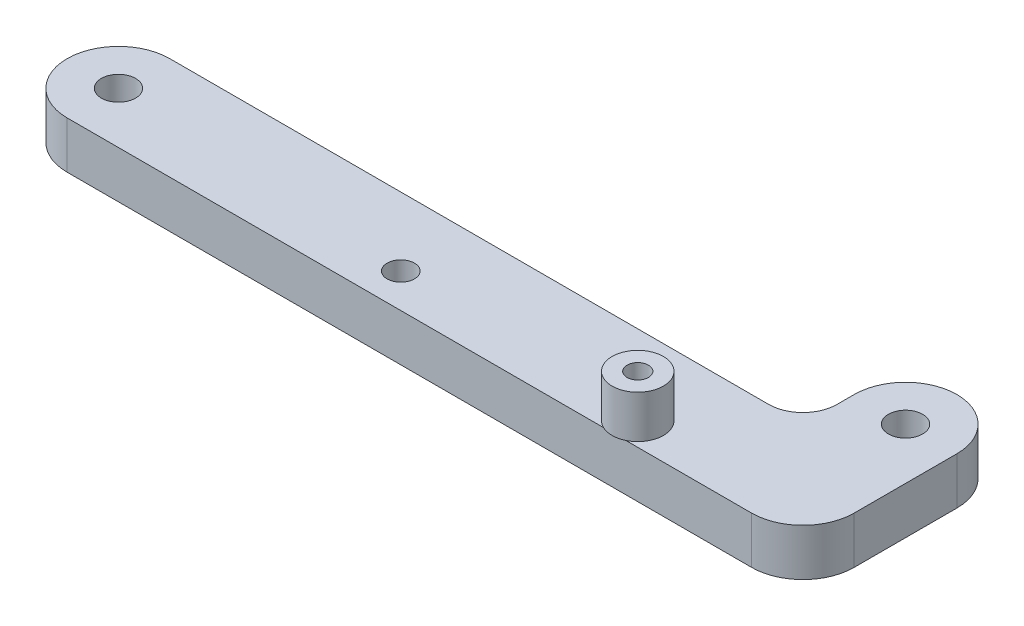
ISO-10303-21;
HEADER;
FILE_DESCRIPTION(('STEP AP214'),'2;1');
FILE_NAME('part.step','',(''),(''),'','','');
FILE_SCHEMA(('AUTOMOTIVE_DESIGN { 1 0 10303 214 1 1 1 1 }'));
ENDSEC;
DATA;
#1=APPLICATION_CONTEXT('core data for automotive mechanical design processes');
#2=APPLICATION_PROTOCOL_DEFINITION('international standard','automotive_design',2000,#1);
#3=PRODUCT_CONTEXT('',#1,'mechanical');
#4=PRODUCT('Part','Part','',(#3));
#5=PRODUCT_RELATED_PRODUCT_CATEGORY('part','',(#4));
#6=PRODUCT_DEFINITION_FORMATION('','',#4);
#7=PRODUCT_DEFINITION_CONTEXT('part definition',#1,'design');
#8=PRODUCT_DEFINITION('design','',#6,#7);
#9=PRODUCT_DEFINITION_SHAPE('','',#8);
#10=(LENGTH_UNIT() NAMED_UNIT(*) SI_UNIT(.MILLI.,.METRE.));
#11=(NAMED_UNIT(*) PLANE_ANGLE_UNIT() SI_UNIT($,.RADIAN.));
#12=(NAMED_UNIT(*) SI_UNIT($,.STERADIAN.) SOLID_ANGLE_UNIT());
#13=UNCERTAINTY_MEASURE_WITH_UNIT(LENGTH_MEASURE(1.E-05),#10,'distance_accuracy_value','');
#14=(GEOMETRIC_REPRESENTATION_CONTEXT(3) GLOBAL_UNCERTAINTY_ASSIGNED_CONTEXT((#13)) GLOBAL_UNIT_ASSIGNED_CONTEXT((#10,
#11,#12)) REPRESENTATION_CONTEXT('',''));
#15=CARTESIAN_POINT('',(0.,0.,0.));
#16=DIRECTION('',(0.,0.,1.));
#17=DIRECTION('',(1.,0.,0.));
#18=AXIS2_PLACEMENT_3D('',#15,#16,#17);
#19=CARTESIAN_POINT('',(0.,5.5,0.));
#20=DIRECTION('',(0.,1.,0.));
#21=DIRECTION('',(0.,0.,-1.));
#22=AXIS2_PLACEMENT_3D('',#19,#20,#21);
#23=PLANE('',#22);
#24=CARTESIAN_POINT('',(35.,5.5,2.));
#25=DIRECTION('',(0.,-1.,0.));
#26=DIRECTION('',(0.,0.,-1.));
#27=AXIS2_PLACEMENT_3D('',#24,#25,#26);
#28=CIRCLE('',#27,1.6);
#29=CARTESIAN_POINT('',(35.,5.5,0.400000000000002));
#30=VERTEX_POINT('',#29);
#31=EDGE_CURVE('E218',#30,#30,#28,.T.);
#32=ORIENTED_EDGE('',*,*,#31,.T.);
#33=EDGE_LOOP('',(#32));
#34=FACE_BOUND('',#33,.T.);
#35=DIRECTION('',(1.,0.,0.));
#36=VECTOR('',#35,1.);
#37=CARTESIAN_POINT('',(0.,5.5,-6.));
#38=LINE('',#37,#36);
#39=CARTESIAN_POINT('',(0.,5.5,-6.));
#40=VERTEX_POINT('',#39);
#41=CARTESIAN_POINT('',(70.,5.5,-6.));
#42=VERTEX_POINT('',#41);
#43=EDGE_CURVE('E159',#40,#42,#38,.T.);
#44=ORIENTED_EDGE('',*,*,#43,.F.);
#45=CARTESIAN_POINT('',(0.,5.5,0.));
#46=DIRECTION('',(0.,-1.,0.));
#47=DIRECTION('',(0.,0.,-1.));
#48=AXIS2_PLACEMENT_3D('',#45,#46,#47);
#49=CIRCLE('',#48,6.);
#50=CARTESIAN_POINT('',(0.,5.5,6.));
#51=VERTEX_POINT('',#50);
#52=EDGE_CURVE('E156',#51,#40,#49,.T.);
#53=ORIENTED_EDGE('',*,*,#52,.F.);
#54=DIRECTION('',(-1.,0.,0.));
#55=VECTOR('',#54,1.);
#56=CARTESIAN_POINT('',(0.,5.5,6.));
#57=LINE('',#56,#55);
#58=CARTESIAN_POINT('',(80.,5.5,6.));
#59=VERTEX_POINT('',#58);
#60=EDGE_CURVE('E166',#59,#51,#57,.T.);
#61=ORIENTED_EDGE('',*,*,#60,.F.);
#62=CARTESIAN_POINT('',(80.,5.5,0.));
#63=DIRECTION('',(0.,-1.,0.));
#64=DIRECTION('',(0.,0.,-1.));
#65=AXIS2_PLACEMENT_3D('',#62,#63,#64);
#66=CIRCLE('',#65,6.);
#67=CARTESIAN_POINT('',(86.,5.5,0.));
#68=VERTEX_POINT('',#67);
#69=EDGE_CURVE('E163',#68,#59,#66,.T.);
#70=ORIENTED_EDGE('',*,*,#69,.F.);
#71=DIRECTION('',(0.,0.,1.));
#72=VECTOR('',#71,1.);
#73=CARTESIAN_POINT('',(86.,5.5,0.));
#74=LINE('',#73,#72);
#75=CARTESIAN_POINT('',(86.,5.5,-12.));
#76=VERTEX_POINT('',#75);
#77=EDGE_CURVE('E119',#76,#68,#74,.T.);
#78=ORIENTED_EDGE('',*,*,#77,.F.);
#79=CARTESIAN_POINT('',(80.,5.5,-12.));
#80=DIRECTION('',(0.,-1.,0.));
#81=DIRECTION('',(0.,0.,-1.));
#82=AXIS2_PLACEMENT_3D('',#79,#80,#81);
#83=CIRCLE('',#82,6.00000000000002);
#84=CARTESIAN_POINT('',(74.,5.5,-12.));
#85=VERTEX_POINT('',#84);
#86=EDGE_CURVE('E113',#85,#76,#83,.T.);
#87=ORIENTED_EDGE('',*,*,#86,.F.);
#88=DIRECTION('',(0.,0.,-1.));
#89=VECTOR('',#88,1.);
#90=CARTESIAN_POINT('',(74.,5.5,0.));
#91=LINE('',#90,#89);
#92=CARTESIAN_POINT('',(74.,5.5,-10.));
#93=VERTEX_POINT('',#92);
#94=EDGE_CURVE('E122',#93,#85,#91,.T.);
#95=ORIENTED_EDGE('',*,*,#94,.F.);
#96=CARTESIAN_POINT('',(70.,5.5,-10.));
#97=DIRECTION('',(0.,-1.,0.));
#98=DIRECTION('',(0.,0.,-1.));
#99=AXIS2_PLACEMENT_3D('',#96,#97,#98);
#100=CIRCLE('',#99,4.);
#101=EDGE_CURVE('E54',#42,#93,#100,.F.);
#102=ORIENTED_EDGE('',*,*,#101,.F.);
#103=EDGE_LOOP('',(#44,#53,#61,#70,#78,#87,#95,#102));
#104=FACE_BOUND('',#103,.T.);
#105=CARTESIAN_POINT('',(0.,5.5,0.));
#106=DIRECTION('',(0.,-1.,0.));
#107=DIRECTION('',(0.,0.,-1.));
#108=AXIS2_PLACEMENT_3D('',#105,#106,#107);
#109=CIRCLE('',#108,2.);
#110=CARTESIAN_POINT('',(0.,5.5,-2.));
#111=VERTEX_POINT('',#110);
#112=EDGE_CURVE('E150',#111,#111,#109,.T.);
#113=ORIENTED_EDGE('',*,*,#112,.T.);
#114=EDGE_LOOP('',(#113));
#115=FACE_BOUND('',#114,.T.);
#116=CARTESIAN_POINT('',(64.,5.5,3.3));
#117=DIRECTION('',(0.,-1.,0.));
#118=DIRECTION('',(0.,0.,-1.));
#119=AXIS2_PLACEMENT_3D('',#116,#117,#118);
#120=CIRCLE('',#119,1.25);
#121=CARTESIAN_POINT('',(64.,5.5,2.05));
#122=VERTEX_POINT('',#121);
#123=EDGE_CURVE('E144',#122,#122,#120,.T.);
#124=ORIENTED_EDGE('',*,*,#123,.T.);
#125=EDGE_LOOP('',(#124));
#126=FACE_BOUND('',#125,.T.);
#127=CARTESIAN_POINT('',(80.,5.5,-12.));
#128=DIRECTION('',(0.,-1.,0.));
#129=DIRECTION('',(0.,0.,-1.));
#130=AXIS2_PLACEMENT_3D('',#127,#128,#129);
#131=CIRCLE('',#130,2.);
#132=CARTESIAN_POINT('',(80.,5.5,-14.));
#133=VERTEX_POINT('',#132);
#134=EDGE_CURVE('E126',#133,#133,#131,.T.);
#135=ORIENTED_EDGE('',*,*,#134,.T.);
#136=EDGE_LOOP('',(#135));
#137=FACE_BOUND('',#136,.T.);
#138=ADVANCED_FACE('F45',(#34,#104,#115,#126,#137),#23,.T.);
#139=CARTESIAN_POINT('',(0.,0.,0.));
#140=DIRECTION('',(0.,1.,0.));
#141=DIRECTION('',(0.,0.,-1.));
#142=AXIS2_PLACEMENT_3D('',#139,#140,#141);
#143=PLANE('',#142);
#144=CARTESIAN_POINT('',(35.,0.,2.));
#145=DIRECTION('',(0.,-1.,0.));
#146=DIRECTION('',(0.,0.,-1.));
#147=AXIS2_PLACEMENT_3D('',#144,#145,#146);
#148=CIRCLE('',#147,1.6);
#149=CARTESIAN_POINT('',(35.,0.,0.400000000000002));
#150=VERTEX_POINT('',#149);
#151=EDGE_CURVE('E49',#150,#150,#148,.T.);
#152=ORIENTED_EDGE('',*,*,#151,.F.);
#153=EDGE_LOOP('',(#152));
#154=FACE_BOUND('',#153,.T.);
#155=DIRECTION('',(0.,0.,1.));
#156=VECTOR('',#155,1.);
#157=CARTESIAN_POINT('',(74.,0.,0.));
#158=LINE('',#157,#156);
#159=CARTESIAN_POINT('',(74.,0.,-12.));
#160=VERTEX_POINT('',#159);
#161=CARTESIAN_POINT('',(74.,0.,-10.));
#162=VERTEX_POINT('',#161);
#163=EDGE_CURVE('E143',#160,#162,#158,.T.);
#164=ORIENTED_EDGE('',*,*,#163,.F.);
#165=CARTESIAN_POINT('',(80.,0.,-12.));
#166=DIRECTION('',(0.,-1.,0.));
#167=DIRECTION('',(0.,0.,-1.));
#168=AXIS2_PLACEMENT_3D('',#165,#166,#167);
#169=CIRCLE('',#168,6.00000000000002);
#170=CARTESIAN_POINT('',(86.,0.,-12.));
#171=VERTEX_POINT('',#170);
#172=EDGE_CURVE('E116',#171,#160,#169,.F.);
#173=ORIENTED_EDGE('',*,*,#172,.F.);
#174=DIRECTION('',(0.,0.,-1.));
#175=VECTOR('',#174,1.);
#176=CARTESIAN_POINT('',(86.,0.,0.));
#177=LINE('',#176,#175);
#178=CARTESIAN_POINT('',(86.,0.,0.));
#179=VERTEX_POINT('',#178);
#180=EDGE_CURVE('E206',#179,#171,#177,.T.);
#181=ORIENTED_EDGE('',*,*,#180,.F.);
#182=CARTESIAN_POINT('',(80.,0.,0.));
#183=DIRECTION('',(0.,-1.,0.));
#184=DIRECTION('',(0.,0.,-1.));
#185=AXIS2_PLACEMENT_3D('',#182,#183,#184);
#186=CIRCLE('',#185,6.);
#187=CARTESIAN_POINT('',(80.,0.,6.));
#188=VERTEX_POINT('',#187);
#189=EDGE_CURVE('E175',#179,#188,#186,.T.);
#190=ORIENTED_EDGE('',*,*,#189,.T.);
#191=DIRECTION('',(-1.,0.,0.));
#192=VECTOR('',#191,1.);
#193=CARTESIAN_POINT('',(0.,0.,6.));
#194=LINE('',#193,#192);
#195=CARTESIAN_POINT('',(0.,0.,6.));
#196=VERTEX_POINT('',#195);
#197=EDGE_CURVE('E160',#188,#196,#194,.T.);
#198=ORIENTED_EDGE('',*,*,#197,.T.);
#199=CARTESIAN_POINT('',(0.,0.,0.));
#200=DIRECTION('',(0.,-1.,0.));
#201=DIRECTION('',(0.,0.,-1.));
#202=AXIS2_PLACEMENT_3D('',#199,#200,#201);
#203=CIRCLE('',#202,6.);
#204=CARTESIAN_POINT('',(0.,0.,-6.));
#205=VERTEX_POINT('',#204);
#206=EDGE_CURVE('E153',#196,#205,#203,.T.);
#207=ORIENTED_EDGE('',*,*,#206,.T.);
#208=DIRECTION('',(1.,0.,0.));
#209=VECTOR('',#208,1.);
#210=CARTESIAN_POINT('',(0.,0.,-6.));
#211=LINE('',#210,#209);
#212=CARTESIAN_POINT('',(70.,0.,-6.));
#213=VERTEX_POINT('',#212);
#214=EDGE_CURVE('E172',#205,#213,#211,.T.);
#215=ORIENTED_EDGE('',*,*,#214,.T.);
#216=CARTESIAN_POINT('',(70.,0.,-10.));
#217=DIRECTION('',(0.,-1.,0.));
#218=DIRECTION('',(0.,0.,-1.));
#219=AXIS2_PLACEMENT_3D('',#216,#217,#218);
#220=CIRCLE('',#219,4.);
#221=EDGE_CURVE('E12',#162,#213,#220,.T.);
#222=ORIENTED_EDGE('',*,*,#221,.F.);
#223=EDGE_LOOP('',(#164,#173,#181,#190,#198,#207,#215,#222));
#224=FACE_BOUND('',#223,.T.);
#225=CARTESIAN_POINT('',(0.,0.,0.));
#226=DIRECTION('',(0.,-1.,0.));
#227=DIRECTION('',(0.,0.,-1.));
#228=AXIS2_PLACEMENT_3D('',#225,#226,#227);
#229=CIRCLE('',#228,2.);
#230=CARTESIAN_POINT('',(0.,0.,-2.));
#231=VERTEX_POINT('',#230);
#232=EDGE_CURVE('E147',#231,#231,#229,.T.);
#233=ORIENTED_EDGE('',*,*,#232,.F.);
#234=EDGE_LOOP('',(#233));
#235=FACE_BOUND('',#234,.T.);
#236=CARTESIAN_POINT('',(64.,0.,3.3));
#237=DIRECTION('',(0.,-1.,0.));
#238=DIRECTION('',(0.,0.,-1.));
#239=AXIS2_PLACEMENT_3D('',#236,#237,#238);
#240=CIRCLE('',#239,1.25);
#241=CARTESIAN_POINT('',(64.,0.,2.05));
#242=VERTEX_POINT('',#241);
#243=EDGE_CURVE('E142',#242,#242,#240,.T.);
#244=ORIENTED_EDGE('',*,*,#243,.F.);
#245=EDGE_LOOP('',(#244));
#246=FACE_BOUND('',#245,.T.);
#247=CARTESIAN_POINT('',(80.,0.,-12.));
#248=DIRECTION('',(0.,-1.,0.));
#249=DIRECTION('',(0.,0.,-1.));
#250=AXIS2_PLACEMENT_3D('',#247,#248,#249);
#251=CIRCLE('',#250,2.);
#252=CARTESIAN_POINT('',(80.,0.,-14.));
#253=VERTEX_POINT('',#252);
#254=EDGE_CURVE('E139',#253,#253,#251,.F.);
#255=ORIENTED_EDGE('',*,*,#254,.T.);
#256=EDGE_LOOP('',(#255));
#257=FACE_BOUND('',#256,.T.);
#258=ADVANCED_FACE('F209',(#154,#224,#235,#246,#257),#143,.F.);
#259=CARTESIAN_POINT('',(0.,5.5,0.));
#260=DIRECTION('',(0.,-1.,0.));
#261=DIRECTION('',(0.,0.,1.));
#262=AXIS2_PLACEMENT_3D('',#259,#260,#261);
#263=CYLINDRICAL_SURFACE('',#262,6.);
#264=ORIENTED_EDGE('',*,*,#206,.F.);
#265=DIRECTION('',(0.,-1.,0.));
#266=VECTOR('',#265,1.);
#267=CARTESIAN_POINT('',(0.,5.5,6.));
#268=LINE('',#267,#266);
#269=EDGE_CURVE('E169',#51,#196,#268,.T.);
#270=ORIENTED_EDGE('',*,*,#269,.F.);
#271=ORIENTED_EDGE('',*,*,#52,.T.);
#272=DIRECTION('',(0.,-1.,0.));
#273=VECTOR('',#272,1.);
#274=CARTESIAN_POINT('',(0.,5.5,-6.));
#275=LINE('',#274,#273);
#276=EDGE_CURVE('E183',#40,#205,#275,.T.);
#277=ORIENTED_EDGE('',*,*,#276,.T.);
#278=EDGE_LOOP('',(#264,#270,#271,#277));
#279=FACE_BOUND('',#278,.T.);
#280=ADVANCED_FACE('F194',(#279),#263,.T.);
#281=CARTESIAN_POINT('',(0.,5.5,-6.));
#282=DIRECTION('',(0.,0.,1.));
#283=DIRECTION('',(-1.,0.,0.));
#284=AXIS2_PLACEMENT_3D('',#281,#282,#283);
#285=PLANE('',#284);
#286=ORIENTED_EDGE('',*,*,#214,.F.);
#287=ORIENTED_EDGE('',*,*,#276,.F.);
#288=ORIENTED_EDGE('',*,*,#43,.T.);
#289=DIRECTION('',(0.,1.,0.));
#290=VECTOR('',#289,1.);
#291=CARTESIAN_POINT('',(70.,5.5,-6.));
#292=LINE('',#291,#290);
#293=EDGE_CURVE('E185',#213,#42,#292,.T.);
#294=ORIENTED_EDGE('',*,*,#293,.F.);
#295=EDGE_LOOP('',(#286,#287,#288,#294));
#296=FACE_BOUND('',#295,.T.);
#297=ADVANCED_FACE('F191',(#296),#285,.F.);
#298=CARTESIAN_POINT('',(80.,5.5,0.));
#299=DIRECTION('',(0.,-1.,0.));
#300=DIRECTION('',(0.,0.,1.));
#301=AXIS2_PLACEMENT_3D('',#298,#299,#300);
#302=CYLINDRICAL_SURFACE('',#301,6.);
#303=ORIENTED_EDGE('',*,*,#69,.T.);
#304=DIRECTION('',(0.,-1.,0.));
#305=VECTOR('',#304,1.);
#306=CARTESIAN_POINT('',(80.,5.5,6.));
#307=LINE('',#306,#305);
#308=EDGE_CURVE('E181',#59,#188,#307,.T.);
#309=ORIENTED_EDGE('',*,*,#308,.T.);
#310=ORIENTED_EDGE('',*,*,#189,.F.);
#311=DIRECTION('',(0.,1.,0.));
#312=VECTOR('',#311,1.);
#313=CARTESIAN_POINT('',(86.,-26.8328157299975,0.));
#314=LINE('',#313,#312);
#315=EDGE_CURVE('E136',#179,#68,#314,.T.);
#316=ORIENTED_EDGE('',*,*,#315,.T.);
#317=EDGE_LOOP('',(#303,#309,#310,#316));
#318=FACE_BOUND('',#317,.T.);
#319=ADVANCED_FACE('F201',(#318),#302,.T.);
#320=CARTESIAN_POINT('',(0.,5.5,6.));
#321=DIRECTION('',(0.,0.,-1.));
#322=DIRECTION('',(1.,0.,0.));
#323=AXIS2_PLACEMENT_3D('',#320,#321,#322);
#324=PLANE('',#323);
#325=ORIENTED_EDGE('',*,*,#197,.F.);
#326=ORIENTED_EDGE('',*,*,#308,.F.);
#327=ORIENTED_EDGE('',*,*,#60,.T.);
#328=ORIENTED_EDGE('',*,*,#269,.T.);
#329=EDGE_LOOP('',(#325,#326,#327,#328));
#330=FACE_BOUND('',#329,.T.);
#331=ADVANCED_FACE('F198',(#330),#324,.F.);
#332=CARTESIAN_POINT('',(0.,5.5,0.));
#333=DIRECTION('',(0.,-1.,0.));
#334=DIRECTION('',(0.,0.,1.));
#335=AXIS2_PLACEMENT_3D('',#332,#333,#334);
#336=CYLINDRICAL_SURFACE('',#335,2.);
#337=ORIENTED_EDGE('',*,*,#112,.F.);
#338=EDGE_LOOP('',(#337));
#339=FACE_BOUND('',#338,.T.);
#340=ORIENTED_EDGE('',*,*,#232,.T.);
#341=EDGE_LOOP('',(#340));
#342=FACE_BOUND('',#341,.T.);
#343=ADVANCED_FACE('F241',(#339,#342),#336,.F.);
#344=CARTESIAN_POINT('',(64.,5.5,3.3));
#345=DIRECTION('',(0.,-1.,0.));
#346=DIRECTION('',(0.,0.,1.));
#347=AXIS2_PLACEMENT_3D('',#344,#345,#346);
#348=CYLINDRICAL_SURFACE('',#347,1.25);
#349=ORIENTED_EDGE('',*,*,#123,.F.);
#350=EDGE_LOOP('',(#349));
#351=FACE_BOUND('',#350,.T.);
#352=ORIENTED_EDGE('',*,*,#243,.T.);
#353=EDGE_LOOP('',(#352));
#354=FACE_BOUND('',#353,.T.);
#355=ADVANCED_FACE('F272',(#351,#354),#348,.F.);
#356=CARTESIAN_POINT('',(74.,-26.8328157299975,0.));
#357=DIRECTION('',(-1.,0.,0.));
#358=DIRECTION('',(0.,0.,-1.));
#359=AXIS2_PLACEMENT_3D('',#356,#357,#358);
#360=PLANE('',#359);
#361=ORIENTED_EDGE('',*,*,#94,.T.);
#362=DIRECTION('',(0.,1.,0.));
#363=VECTOR('',#362,1.);
#364=CARTESIAN_POINT('',(74.,-26.8328157299975,-12.));
#365=LINE('',#364,#363);
#366=EDGE_CURVE('E110',#160,#85,#365,.T.);
#367=ORIENTED_EDGE('',*,*,#366,.F.);
#368=ORIENTED_EDGE('',*,*,#163,.T.);
#369=DIRECTION('',(0.,1.,0.));
#370=VECTOR('',#369,1.);
#371=CARTESIAN_POINT('',(74.,-26.8328157299975,-10.));
#372=LINE('',#371,#370);
#373=EDGE_CURVE('E61',#93,#162,#372,.F.);
#374=ORIENTED_EDGE('',*,*,#373,.F.);
#375=EDGE_LOOP('',(#361,#367,#368,#374));
#376=FACE_BOUND('',#375,.T.);
#377=ADVANCED_FACE('F123',(#376),#360,.T.);
#378=CARTESIAN_POINT('',(80.,-26.8328157299975,-12.));
#379=DIRECTION('',(0.,1.,0.));
#380=DIRECTION('',(0.,0.,-1.));
#381=AXIS2_PLACEMENT_3D('',#378,#379,#380);
#382=CYLINDRICAL_SURFACE('',#381,6.00000000000002);
#383=ORIENTED_EDGE('',*,*,#172,.T.);
#384=ORIENTED_EDGE('',*,*,#366,.T.);
#385=ORIENTED_EDGE('',*,*,#86,.T.);
#386=DIRECTION('',(0.,1.,0.));
#387=VECTOR('',#386,1.);
#388=CARTESIAN_POINT('',(86.,-26.8328157299975,-12.));
#389=LINE('',#388,#387);
#390=EDGE_CURVE('E118',#171,#76,#389,.T.);
#391=ORIENTED_EDGE('',*,*,#390,.F.);
#392=EDGE_LOOP('',(#383,#384,#385,#391));
#393=FACE_BOUND('',#392,.T.);
#394=ADVANCED_FACE('F111',(#393),#382,.T.);
#395=CARTESIAN_POINT('',(86.,-26.8328157299975,0.));
#396=DIRECTION('',(1.,0.,0.));
#397=DIRECTION('',(0.,0.,1.));
#398=AXIS2_PLACEMENT_3D('',#395,#396,#397);
#399=PLANE('',#398);
#400=ORIENTED_EDGE('',*,*,#180,.T.);
#401=ORIENTED_EDGE('',*,*,#390,.T.);
#402=ORIENTED_EDGE('',*,*,#77,.T.);
#403=ORIENTED_EDGE('',*,*,#315,.F.);
#404=EDGE_LOOP('',(#400,#401,#402,#403));
#405=FACE_BOUND('',#404,.T.);
#406=ADVANCED_FACE('F205',(#405),#399,.T.);
#407=CARTESIAN_POINT('',(80.,-26.8328157299975,-12.));
#408=DIRECTION('',(0.,1.,0.));
#409=DIRECTION('',(0.,0.,-1.));
#410=AXIS2_PLACEMENT_3D('',#407,#408,#409);
#411=CYLINDRICAL_SURFACE('',#410,2.);
#412=ORIENTED_EDGE('',*,*,#254,.F.);
#413=EDGE_LOOP('',(#412));
#414=FACE_BOUND('',#413,.T.);
#415=ORIENTED_EDGE('',*,*,#134,.F.);
#416=EDGE_LOOP('',(#415));
#417=FACE_BOUND('',#416,.T.);
#418=ADVANCED_FACE('F231',(#414,#417),#411,.F.);
#419=CARTESIAN_POINT('',(70.,5.5,-10.));
#420=DIRECTION('',(0.,1.,0.));
#421=DIRECTION('',(0.,0.,-1.));
#422=AXIS2_PLACEMENT_3D('',#419,#420,#421);
#423=CYLINDRICAL_SURFACE('',#422,4.);
#424=ORIENTED_EDGE('',*,*,#221,.T.);
#425=ORIENTED_EDGE('',*,*,#293,.T.);
#426=ORIENTED_EDGE('',*,*,#101,.T.);
#427=ORIENTED_EDGE('',*,*,#373,.T.);
#428=EDGE_LOOP('',(#424,#425,#426,#427));
#429=FACE_BOUND('',#428,.T.);
#430=ADVANCED_FACE('F47',(#429),#423,.F.);
#431=CARTESIAN_POINT('',(35.,-4.5,2.));
#432=DIRECTION('',(0.,1.,0.));
#433=DIRECTION('',(0.,0.,-1.));
#434=AXIS2_PLACEMENT_3D('',#431,#432,#433);
#435=CYLINDRICAL_SURFACE('',#434,1.6);
#436=ORIENTED_EDGE('',*,*,#31,.F.);
#437=EDGE_LOOP('',(#436));
#438=FACE_BOUND('',#437,.T.);
#439=ORIENTED_EDGE('',*,*,#151,.T.);
#440=EDGE_LOOP('',(#439));
#441=FACE_BOUND('',#440,.T.);
#442=ADVANCED_FACE('F225',(#438,#441),#435,.F.);
#443=CLOSED_SHELL('',(#138,#258,#280,#297,#319,#331,#343,#355,#377,#394,#406,#418,#430,#442));
#444=MANIFOLD_SOLID_BREP('B2',#443);
#445=CARTESIAN_POINT('',(64.,10.5,3.3));
#446=DIRECTION('',(0.,1.,0.));
#447=DIRECTION('',(0.,0.,-1.));
#448=AXIS2_PLACEMENT_3D('',#445,#446,#447);
#449=PLANE('',#448);
#450=CARTESIAN_POINT('',(64.,10.5,3.3));
#451=DIRECTION('',(0.,-1.,0.));
#452=DIRECTION('',(0.,0.,-1.));
#453=AXIS2_PLACEMENT_3D('',#450,#451,#452);
#454=CIRCLE('',#453,3.00000000000001);
#455=CARTESIAN_POINT('',(64.,10.5,0.299999999999992));
#456=VERTEX_POINT('',#455);
#457=EDGE_CURVE('E44',#456,#456,#454,.T.);
#458=ORIENTED_EDGE('',*,*,#457,.F.);
#459=EDGE_LOOP('',(#458));
#460=FACE_BOUND('',#459,.T.);
#461=CARTESIAN_POINT('',(64.,10.5,3.3));
#462=DIRECTION('',(0.,-1.,0.));
#463=DIRECTION('',(0.,0.,-1.));
#464=AXIS2_PLACEMENT_3D('',#461,#462,#463);
#465=CIRCLE('',#464,1.25);
#466=CARTESIAN_POINT('',(64.,10.5,2.05));
#467=VERTEX_POINT('',#466);
#468=EDGE_CURVE('E374',#467,#467,#465,.T.);
#469=ORIENTED_EDGE('',*,*,#468,.T.);
#470=EDGE_LOOP('',(#469));
#471=FACE_BOUND('',#470,.T.);
#472=ADVANCED_FACE('F363',(#460,#471),#449,.T.);
#473=CARTESIAN_POINT('',(64.,5.5,3.3));
#474=DIRECTION('',(0.,1.,0.));
#475=DIRECTION('',(0.,0.,-1.));
#476=AXIS2_PLACEMENT_3D('',#473,#474,#475);
#477=PLANE('',#476);
#478=CARTESIAN_POINT('',(64.,5.5,3.3));
#479=DIRECTION('',(0.,-1.,0.));
#480=DIRECTION('',(0.,0.,-1.));
#481=AXIS2_PLACEMENT_3D('',#478,#479,#480);
#482=CIRCLE('',#481,3.00000000000001);
#483=CARTESIAN_POINT('',(64.,5.5,0.299999999999992));
#484=VERTEX_POINT('',#483);
#485=EDGE_CURVE('E367',#484,#484,#482,.T.);
#486=ORIENTED_EDGE('',*,*,#485,.T.);
#487=EDGE_LOOP('',(#486));
#488=FACE_BOUND('',#487,.T.);
#489=CARTESIAN_POINT('',(64.,5.5,3.3));
#490=DIRECTION('',(0.,-1.,0.));
#491=DIRECTION('',(0.,0.,-1.));
#492=AXIS2_PLACEMENT_3D('',#489,#490,#491);
#493=CIRCLE('',#492,1.25);
#494=CARTESIAN_POINT('',(64.,5.5,2.05));
#495=VERTEX_POINT('',#494);
#496=EDGE_CURVE('E376',#495,#495,#493,.T.);
#497=ORIENTED_EDGE('',*,*,#496,.F.);
#498=EDGE_LOOP('',(#497));
#499=FACE_BOUND('',#498,.T.);
#500=ADVANCED_FACE('F389',(#488,#499),#477,.F.);
#501=CARTESIAN_POINT('',(64.,10.5,3.3));
#502=DIRECTION('',(0.,-1.,0.));
#503=DIRECTION('',(0.,0.,1.));
#504=AXIS2_PLACEMENT_3D('',#501,#502,#503);
#505=CYLINDRICAL_SURFACE('',#504,3.00000000000001);
#506=ORIENTED_EDGE('',*,*,#457,.T.);
#507=EDGE_LOOP('',(#506));
#508=FACE_BOUND('',#507,.T.);
#509=ORIENTED_EDGE('',*,*,#485,.F.);
#510=EDGE_LOOP('',(#509));
#511=FACE_BOUND('',#510,.T.);
#512=ADVANCED_FACE('F365',(#508,#511),#505,.T.);
#513=CARTESIAN_POINT('',(64.,10.5,3.3));
#514=DIRECTION('',(0.,-1.,0.));
#515=DIRECTION('',(0.,0.,1.));
#516=AXIS2_PLACEMENT_3D('',#513,#514,#515);
#517=CYLINDRICAL_SURFACE('',#516,1.25);
#518=ORIENTED_EDGE('',*,*,#468,.F.);
#519=EDGE_LOOP('',(#518));
#520=FACE_BOUND('',#519,.T.);
#521=ORIENTED_EDGE('',*,*,#496,.T.);
#522=EDGE_LOOP('',(#521));
#523=FACE_BOUND('',#522,.T.);
#524=ADVANCED_FACE('F383',(#520,#523),#517,.F.);
#525=CLOSED_SHELL('',(#472,#500,#512,#524));
#526=MANIFOLD_SOLID_BREP('B6',#525);
#527=ADVANCED_BREP_SHAPE_REPRESENTATION('',(#18,#444,#526),#14);
#528=SHAPE_DEFINITION_REPRESENTATION(#9,#527);
ENDSEC;
END-ISO-10303-21;
